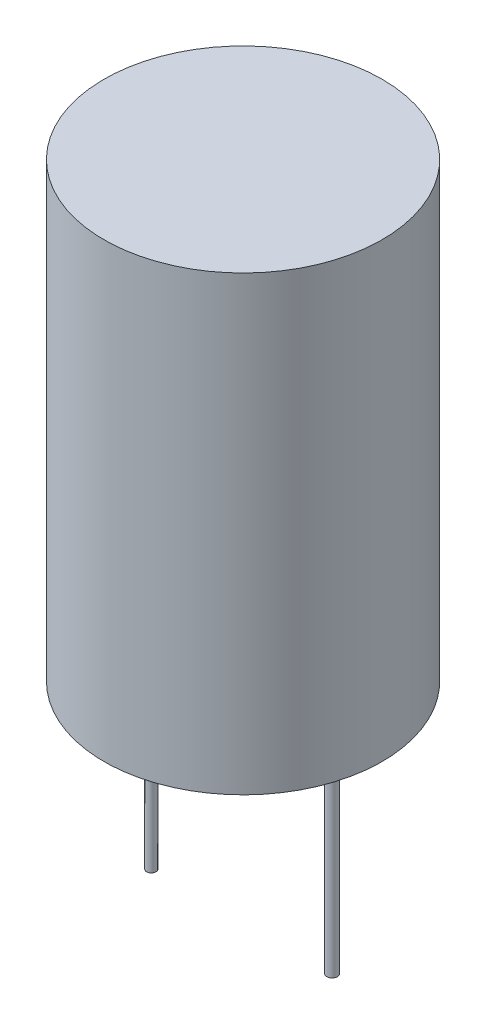
ISO-10303-21;
HEADER;
FILE_DESCRIPTION(('STEP AP214'),'2;1');
FILE_NAME('part.step','',(''),(''),'','','');
FILE_SCHEMA(('AUTOMOTIVE_DESIGN { 1 0 10303 214 1 1 1 1 }'));
ENDSEC;
DATA;
#1=APPLICATION_CONTEXT('core data for automotive mechanical design processes');
#2=APPLICATION_PROTOCOL_DEFINITION('international standard','automotive_design',2000,#1);
#3=PRODUCT_CONTEXT('',#1,'mechanical');
#4=PRODUCT('Part','Part','',(#3));
#5=PRODUCT_RELATED_PRODUCT_CATEGORY('part','',(#4));
#6=PRODUCT_DEFINITION_FORMATION('','',#4);
#7=PRODUCT_DEFINITION_CONTEXT('part definition',#1,'design');
#8=PRODUCT_DEFINITION('design','',#6,#7);
#9=PRODUCT_DEFINITION_SHAPE('','',#8);
#10=(LENGTH_UNIT() NAMED_UNIT(*) SI_UNIT(.MILLI.,.METRE.));
#11=(NAMED_UNIT(*) PLANE_ANGLE_UNIT() SI_UNIT($,.RADIAN.));
#12=(NAMED_UNIT(*) SI_UNIT($,.STERADIAN.) SOLID_ANGLE_UNIT());
#13=UNCERTAINTY_MEASURE_WITH_UNIT(LENGTH_MEASURE(1.E-05),#10,'distance_accuracy_value','');
#14=(GEOMETRIC_REPRESENTATION_CONTEXT(3) GLOBAL_UNCERTAINTY_ASSIGNED_CONTEXT((#13)) GLOBAL_UNIT_ASSIGNED_CONTEXT((#10,
#11,#12)) REPRESENTATION_CONTEXT('',''));
#15=CARTESIAN_POINT('',(0.,0.,0.));
#16=DIRECTION('',(0.,0.,1.));
#17=DIRECTION('',(1.,0.,0.));
#18=AXIS2_PLACEMENT_3D('',#15,#16,#17);
#19=CARTESIAN_POINT('',(0.,13.,0.));
#20=DIRECTION('',(0.,-1.,0.));
#21=DIRECTION('',(0.,0.,-1.));
#22=AXIS2_PLACEMENT_3D('',#19,#20,#21);
#23=CYLINDRICAL_SURFACE('',#22,4.);
#24=CARTESIAN_POINT('',(0.,13.,0.));
#25=DIRECTION('',(0.,1.,0.));
#26=DIRECTION('',(0.,0.,1.));
#27=AXIS2_PLACEMENT_3D('',#24,#25,#26);
#28=CIRCLE('',#27,4.);
#29=CARTESIAN_POINT('',(0.,13.,-4.));
#30=VERTEX_POINT('',#29);
#31=EDGE_CURVE('E42',#30,#30,#28,.T.);
#32=CARTESIAN_POINT('',(0.,0.,0.));
#33=DIRECTION('',(0.,1.,0.));
#34=DIRECTION('',(0.,0.,1.));
#35=AXIS2_PLACEMENT_3D('',#32,#33,#34);
#36=CIRCLE('',#35,4.);
#37=CARTESIAN_POINT('',(0.,0.,-4.));
#38=VERTEX_POINT('',#37);
#39=EDGE_CURVE('E46',#38,#38,#36,.T.);
#40=CARTESIAN_POINT('',(0.,13.,-4.));
#41=CARTESIAN_POINT('',(0.,12.8645833333333,-4.));
#42=CARTESIAN_POINT('',(0.,12.7291666666667,-4.));
#43=CARTESIAN_POINT('',(0.,12.4583333333333,-4.));
#44=CARTESIAN_POINT('',(0.,12.3229166666667,-4.));
#45=CARTESIAN_POINT('',(0.,12.0520833333333,-4.));
#46=CARTESIAN_POINT('',(0.,11.9166666666667,-4.));
#47=CARTESIAN_POINT('',(0.,11.6458333333333,-4.));
#48=CARTESIAN_POINT('',(0.,11.5104166666667,-4.));
#49=CARTESIAN_POINT('',(0.,11.2395833333333,-4.));
#50=CARTESIAN_POINT('',(0.,11.1041666666667,-4.));
#51=CARTESIAN_POINT('',(0.,10.8333333333333,-4.));
#52=CARTESIAN_POINT('',(0.,10.6979166666667,-4.));
#53=CARTESIAN_POINT('',(0.,10.4270833333333,-4.));
#54=CARTESIAN_POINT('',(0.,10.2916666666667,-4.));
#55=CARTESIAN_POINT('',(0.,10.0208333333333,-4.));
#56=CARTESIAN_POINT('',(0.,9.88541666666667,-4.));
#57=CARTESIAN_POINT('',(0.,9.61458333333333,-4.));
#58=CARTESIAN_POINT('',(0.,9.47916666666667,-4.));
#59=CARTESIAN_POINT('',(0.,9.20833333333333,-4.));
#60=CARTESIAN_POINT('',(0.,9.07291666666667,-4.));
#61=CARTESIAN_POINT('',(0.,8.80208333333333,-4.));
#62=CARTESIAN_POINT('',(0.,8.66666666666667,-4.));
#63=CARTESIAN_POINT('',(0.,8.39583333333333,-4.));
#64=CARTESIAN_POINT('',(0.,8.26041666666667,-4.));
#65=CARTESIAN_POINT('',(0.,7.98958333333333,-4.));
#66=CARTESIAN_POINT('',(0.,7.85416666666667,-4.));
#67=CARTESIAN_POINT('',(0.,7.58333333333333,-4.));
#68=CARTESIAN_POINT('',(0.,7.44791666666667,-4.));
#69=CARTESIAN_POINT('',(0.,7.17708333333333,-4.));
#70=CARTESIAN_POINT('',(0.,7.04166666666667,-4.));
#71=CARTESIAN_POINT('',(0.,6.77083333333333,-4.));
#72=CARTESIAN_POINT('',(0.,6.63541666666667,-4.));
#73=CARTESIAN_POINT('',(0.,6.36458333333333,-4.));
#74=CARTESIAN_POINT('',(0.,6.22916666666667,-4.));
#75=CARTESIAN_POINT('',(0.,5.95833333333333,-4.));
#76=CARTESIAN_POINT('',(0.,5.82291666666667,-4.));
#77=CARTESIAN_POINT('',(0.,5.55208333333333,-4.));
#78=CARTESIAN_POINT('',(0.,5.41666666666667,-4.));
#79=CARTESIAN_POINT('',(0.,5.14583333333333,-4.));
#80=CARTESIAN_POINT('',(0.,5.01041666666667,-4.));
#81=CARTESIAN_POINT('',(0.,4.73958333333333,-4.));
#82=CARTESIAN_POINT('',(0.,4.60416666666667,-4.));
#83=CARTESIAN_POINT('',(0.,4.33333333333333,-4.));
#84=CARTESIAN_POINT('',(0.,4.19791666666667,-4.));
#85=CARTESIAN_POINT('',(0.,3.92708333333333,-4.));
#86=CARTESIAN_POINT('',(0.,3.79166666666667,-4.));
#87=CARTESIAN_POINT('',(0.,3.52083333333333,-4.));
#88=CARTESIAN_POINT('',(0.,3.38541666666667,-4.));
#89=CARTESIAN_POINT('',(0.,3.11458333333333,-4.));
#90=CARTESIAN_POINT('',(0.,2.97916666666667,-4.));
#91=CARTESIAN_POINT('',(0.,2.70833333333333,-4.));
#92=CARTESIAN_POINT('',(0.,2.57291666666667,-4.));
#93=CARTESIAN_POINT('',(0.,2.30208333333333,-4.));
#94=CARTESIAN_POINT('',(0.,2.16666666666667,-4.));
#95=CARTESIAN_POINT('',(0.,1.89583333333333,-4.));
#96=CARTESIAN_POINT('',(0.,1.76041666666667,-4.));
#97=CARTESIAN_POINT('',(0.,1.48958333333333,-4.));
#98=CARTESIAN_POINT('',(0.,1.35416666666667,-4.));
#99=CARTESIAN_POINT('',(0.,1.08333333333333,-4.));
#100=CARTESIAN_POINT('',(0.,0.947916666666667,-4.));
#101=CARTESIAN_POINT('',(0.,0.677083333333334,-4.));
#102=CARTESIAN_POINT('',(0.,0.541666666666667,-4.));
#103=CARTESIAN_POINT('',(0.,0.270833333333334,-4.));
#104=CARTESIAN_POINT('',(0.,0.135416666666667,-4.));
#105=CARTESIAN_POINT('',(0.,0.,-4.));
#106=B_SPLINE_CURVE_WITH_KNOTS('',3,(#40,#41,#42,#43,#44,#45,#46,#47,#48,#49,#50,#51,#52,#53,
#54,#55,#56,#57,#58,#59,#60,#61,#62,#63,#64,#65,#66,#67,#68,#69,#70,#71,#72,#73,#74,#75,#76,#77,
#78,#79,#80,#81,#82,#83,#84,#85,#86,#87,#88,#89,#90,#91,#92,#93,#94,#95,#96,#97,#98,#99,#100,
#101,#102,#103,#104,#105),.UNSPECIFIED.,.F.,.F.,(4,2,2,2,2,2,2,2,2,2,2,2,2,2,2,2,2,2,2,2,2,2,2,
2,2,2,2,2,2,2,2,2,4),(0.,0.406249999999999,0.812499999999999,1.21875,1.625,2.03125,2.4375,
2.84375,3.25,3.65625,4.0625,4.46875,4.875,5.28125,5.6875,6.09375,6.5,6.90625,7.3125,7.71875,
8.125,8.53125,8.9375,9.34375,9.75,10.15625,10.5625,10.96875,11.375,11.78125,12.1875,12.59375,
13.),.UNSPECIFIED.);
#107=EDGE_CURVE('BSEAM32',#30,#38,#106,.T.);
#108=ORIENTED_EDGE('',*,*,#31,.F.);
#109=ORIENTED_EDGE('',*,*,#39,.T.);
#110=ORIENTED_EDGE('',*,*,#107,.T.);
#111=ORIENTED_EDGE('',*,*,#107,.F.);
#112=EDGE_LOOP('',(#108,#110,#109,#111));
#113=FACE_BOUND('',#112,.T.);
#114=ADVANCED_FACE('F32',(#113),#23,.T.);
#115=CARTESIAN_POINT('',(0.,13.,0.));
#116=DIRECTION('',(0.,1.,0.));
#117=DIRECTION('',(0.,0.,1.));
#118=AXIS2_PLACEMENT_3D('',#115,#116,#117);
#119=PLANE('',#118);
#120=ORIENTED_EDGE('',*,*,#31,.T.);
#121=EDGE_LOOP('',(#120));
#122=FACE_BOUND('',#121,.T.);
#123=ADVANCED_FACE('F73',(#122),#119,.T.);
#124=CARTESIAN_POINT('',(0.,0.,0.));
#125=DIRECTION('',(0.,1.,0.));
#126=DIRECTION('',(0.,0.,1.));
#127=AXIS2_PLACEMENT_3D('',#124,#125,#126);
#128=PLANE('',#127);
#129=CARTESIAN_POINT('',(2.56166619679583,0.,0.));
#130=DIRECTION('',(0.,1.,0.));
#131=DIRECTION('',(0.,0.,1.));
#132=AXIS2_PLACEMENT_3D('',#129,#130,#131);
#133=CIRCLE('',#132,0.154729583298452);
#134=CARTESIAN_POINT('',(2.56166619679583,0.,0.154729583298452));
#135=VERTEX_POINT('',#134);
#136=EDGE_CURVE('E10',#135,#135,#133,.F.);
#137=ORIENTED_EDGE('',*,*,#136,.F.);
#138=EDGE_LOOP('',(#137));
#139=FACE_BOUND('',#138,.T.);
#140=CARTESIAN_POINT('',(-2.63962995061135,0.,0.));
#141=DIRECTION('',(0.,1.,0.));
#142=DIRECTION('',(0.,0.,1.));
#143=AXIS2_PLACEMENT_3D('',#140,#141,#142);
#144=CIRCLE('',#143,0.133652149398044);
#145=CARTESIAN_POINT('',(-2.63962995061135,0.,0.133652149398044));
#146=VERTEX_POINT('',#145);
#147=EDGE_CURVE('E38',#146,#146,#144,.F.);
#148=ORIENTED_EDGE('',*,*,#147,.F.);
#149=EDGE_LOOP('',(#148));
#150=FACE_BOUND('',#149,.T.);
#151=ORIENTED_EDGE('',*,*,#39,.F.);
#152=EDGE_LOOP('',(#151));
#153=FACE_BOUND('',#152,.T.);
#154=ADVANCED_FACE('F78',(#139,#150,#153),#128,.F.);
#155=CARTESIAN_POINT('',(-2.63962995061135,-6.,0.));
#156=DIRECTION('',(0.,1.,0.));
#157=DIRECTION('',(0.,0.,1.));
#158=AXIS2_PLACEMENT_3D('',#155,#156,#157);
#159=CYLINDRICAL_SURFACE('',#158,0.133652149398044);
#160=CARTESIAN_POINT('',(-2.63962995061135,-6.,0.));
#161=DIRECTION('',(0.,-1.,0.));
#162=DIRECTION('',(0.,0.,-1.));
#163=AXIS2_PLACEMENT_3D('',#160,#161,#162);
#164=CIRCLE('',#163,0.133652149398044);
#165=CARTESIAN_POINT('',(-2.63962995061135,-6.,-0.133652149398044));
#166=VERTEX_POINT('',#165);
#167=EDGE_CURVE('E50',#166,#166,#164,.T.);
#168=ORIENTED_EDGE('',*,*,#167,.F.);
#169=EDGE_LOOP('',(#168));
#170=FACE_BOUND('',#169,.T.);
#171=ORIENTED_EDGE('',*,*,#147,.T.);
#172=EDGE_LOOP('',(#171));
#173=FACE_BOUND('',#172,.T.);
#174=ADVANCED_FACE('F69',(#170,#173),#159,.T.);
#175=CARTESIAN_POINT('',(-2.63962995061135,-6.,0.));
#176=DIRECTION('',(0.,-1.,0.));
#177=DIRECTION('',(0.,0.,-1.));
#178=AXIS2_PLACEMENT_3D('',#175,#176,#177);
#179=PLANE('',#178);
#180=ORIENTED_EDGE('',*,*,#167,.T.);
#181=EDGE_LOOP('',(#180));
#182=FACE_BOUND('',#181,.T.);
#183=ADVANCED_FACE('F62',(#182),#179,.T.);
#184=CARTESIAN_POINT('',(2.56166619679583,-6.,0.));
#185=DIRECTION('',(0.,1.,0.));
#186=DIRECTION('',(0.,0.,1.));
#187=AXIS2_PLACEMENT_3D('',#184,#185,#186);
#188=CYLINDRICAL_SURFACE('',#187,0.154729583298452);
#189=CARTESIAN_POINT('',(2.56166619679583,-6.,0.));
#190=DIRECTION('',(0.,-1.,0.));
#191=DIRECTION('',(0.,0.,-1.));
#192=AXIS2_PLACEMENT_3D('',#189,#190,#191);
#193=CIRCLE('',#192,0.154729583298452);
#194=CARTESIAN_POINT('',(2.56166619679583,-6.,-0.154729583298452));
#195=VERTEX_POINT('',#194);
#196=EDGE_CURVE('E54',#195,#195,#193,.T.);
#197=ORIENTED_EDGE('',*,*,#196,.F.);
#198=EDGE_LOOP('',(#197));
#199=FACE_BOUND('',#198,.T.);
#200=ORIENTED_EDGE('',*,*,#136,.T.);
#201=EDGE_LOOP('',(#200));
#202=FACE_BOUND('',#201,.T.);
#203=ADVANCED_FACE('F60',(#199,#202),#188,.T.);
#204=CARTESIAN_POINT('',(2.56166619679583,-6.,0.));
#205=DIRECTION('',(0.,-1.,0.));
#206=DIRECTION('',(0.,0.,-1.));
#207=AXIS2_PLACEMENT_3D('',#204,#205,#206);
#208=PLANE('',#207);
#209=ORIENTED_EDGE('',*,*,#196,.T.);
#210=EDGE_LOOP('',(#209));
#211=FACE_BOUND('',#210,.T.);
#212=ADVANCED_FACE('F58',(#211),#208,.T.);
#213=CLOSED_SHELL('',(#114,#123,#154,#174,#183,#203,#212));
#214=MANIFOLD_SOLID_BREP('B2',#213);
#215=ADVANCED_BREP_SHAPE_REPRESENTATION('',(#18,#214),#14);
#216=SHAPE_DEFINITION_REPRESENTATION(#9,#215);
ENDSEC;
END-ISO-10303-21;
